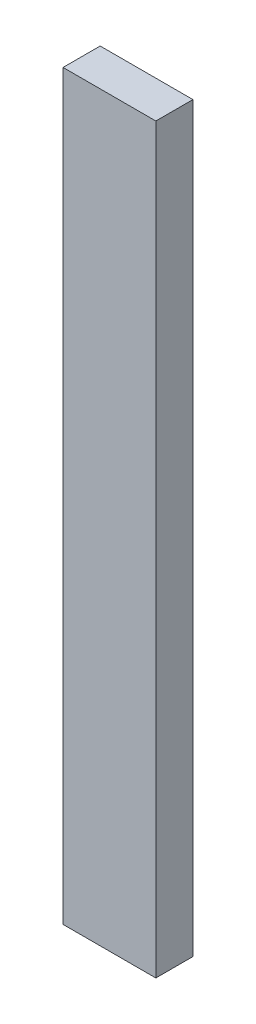
ISO-10303-21;
HEADER;
FILE_DESCRIPTION(('STEP AP214'),'2;1');
FILE_NAME('part.step','',(''),(''),'','','');
FILE_SCHEMA(('AUTOMOTIVE_DESIGN { 1 0 10303 214 1 1 1 1 }'));
ENDSEC;
DATA;
#1=APPLICATION_CONTEXT('core data for automotive mechanical design processes');
#2=APPLICATION_PROTOCOL_DEFINITION('international standard','automotive_design',2000,#1);
#3=PRODUCT_CONTEXT('',#1,'mechanical');
#4=PRODUCT('Part','Part','',(#3));
#5=PRODUCT_RELATED_PRODUCT_CATEGORY('part','',(#4));
#6=PRODUCT_DEFINITION_FORMATION('','',#4);
#7=PRODUCT_DEFINITION_CONTEXT('part definition',#1,'design');
#8=PRODUCT_DEFINITION('design','',#6,#7);
#9=PRODUCT_DEFINITION_SHAPE('','',#8);
#10=(LENGTH_UNIT() NAMED_UNIT(*) SI_UNIT(.MILLI.,.METRE.));
#11=(NAMED_UNIT(*) PLANE_ANGLE_UNIT() SI_UNIT($,.RADIAN.));
#12=(NAMED_UNIT(*) SI_UNIT($,.STERADIAN.) SOLID_ANGLE_UNIT());
#13=UNCERTAINTY_MEASURE_WITH_UNIT(LENGTH_MEASURE(1.E-05),#10,'distance_accuracy_value','');
#14=(GEOMETRIC_REPRESENTATION_CONTEXT(3) GLOBAL_UNCERTAINTY_ASSIGNED_CONTEXT((#13)) GLOBAL_UNIT_ASSIGNED_CONTEXT((#10,
#11,#12)) REPRESENTATION_CONTEXT('',''));
#15=CARTESIAN_POINT('',(0.,0.,0.));
#16=DIRECTION('',(0.,0.,1.));
#17=DIRECTION('',(1.,0.,0.));
#18=AXIS2_PLACEMENT_3D('',#15,#16,#17);
#19=CARTESIAN_POINT('',(0.,200.,0.));
#20=DIRECTION('',(1.,0.,0.));
#21=DIRECTION('',(0.,0.,-1.));
#22=AXIS2_PLACEMENT_3D('',#19,#20,#21);
#23=PLANE('',#22);
#24=DIRECTION('',(0.,0.,1.));
#25=VECTOR('',#24,1.);
#26=CARTESIAN_POINT('',(0.,0.,0.));
#27=LINE('',#26,#25);
#28=CARTESIAN_POINT('',(0.,0.,-10.));
#29=VERTEX_POINT('',#28);
#30=CARTESIAN_POINT('',(0.,0.,0.));
#31=VERTEX_POINT('',#30);
#32=EDGE_CURVE('E102',#29,#31,#27,.T.);
#33=ORIENTED_EDGE('',*,*,#32,.T.);
#34=DIRECTION('',(0.,-1.,0.));
#35=VECTOR('',#34,1.);
#36=CARTESIAN_POINT('',(0.,200.,0.));
#37=LINE('',#36,#35);
#38=CARTESIAN_POINT('',(0.,200.,0.));
#39=VERTEX_POINT('',#38);
#40=EDGE_CURVE('E11',#39,#31,#37,.T.);
#41=ORIENTED_EDGE('',*,*,#40,.F.);
#42=DIRECTION('',(0.,0.,1.));
#43=VECTOR('',#42,1.);
#44=CARTESIAN_POINT('',(0.,200.,0.));
#45=LINE('',#44,#43);
#46=CARTESIAN_POINT('',(0.,200.,-10.));
#47=VERTEX_POINT('',#46);
#48=EDGE_CURVE('E90',#47,#39,#45,.T.);
#49=ORIENTED_EDGE('',*,*,#48,.F.);
#50=DIRECTION('',(0.,-1.,0.));
#51=VECTOR('',#50,1.);
#52=CARTESIAN_POINT('',(0.,200.,-10.));
#53=LINE('',#52,#51);
#54=EDGE_CURVE('E98',#47,#29,#53,.T.);
#55=ORIENTED_EDGE('',*,*,#54,.T.);
#56=EDGE_LOOP('',(#33,#41,#49,#55));
#57=FACE_BOUND('',#56,.T.);
#58=ADVANCED_FACE('F39',(#57),#23,.F.);
#59=CARTESIAN_POINT('',(0.,200.,0.));
#60=DIRECTION('',(0.,0.,-1.));
#61=DIRECTION('',(-1.,0.,0.));
#62=AXIS2_PLACEMENT_3D('',#59,#60,#61);
#63=PLANE('',#62);
#64=DIRECTION('',(1.,0.,0.));
#65=VECTOR('',#64,1.);
#66=CARTESIAN_POINT('',(0.,0.,0.));
#67=LINE('',#66,#65);
#68=CARTESIAN_POINT('',(25.,0.,0.));
#69=VERTEX_POINT('',#68);
#70=EDGE_CURVE('E94',#31,#69,#67,.T.);
#71=ORIENTED_EDGE('',*,*,#70,.T.);
#72=DIRECTION('',(0.,-1.,0.));
#73=VECTOR('',#72,1.);
#74=CARTESIAN_POINT('',(25.,200.,0.));
#75=LINE('',#74,#73);
#76=CARTESIAN_POINT('',(25.,200.,0.));
#77=VERTEX_POINT('',#76);
#78=EDGE_CURVE('E47',#77,#69,#75,.T.);
#79=ORIENTED_EDGE('',*,*,#78,.F.);
#80=DIRECTION('',(1.,0.,0.));
#81=VECTOR('',#80,1.);
#82=CARTESIAN_POINT('',(0.,200.,0.));
#83=LINE('',#82,#81);
#84=EDGE_CURVE('E85',#39,#77,#83,.T.);
#85=ORIENTED_EDGE('',*,*,#84,.F.);
#86=ORIENTED_EDGE('',*,*,#40,.T.);
#87=EDGE_LOOP('',(#71,#79,#85,#86));
#88=FACE_BOUND('',#87,.T.);
#89=ADVANCED_FACE('F93',(#88),#63,.F.);
#90=CARTESIAN_POINT('',(25.,200.,0.));
#91=DIRECTION('',(-1.,0.,0.));
#92=DIRECTION('',(0.,0.,1.));
#93=AXIS2_PLACEMENT_3D('',#90,#91,#92);
#94=PLANE('',#93);
#95=DIRECTION('',(0.,0.,-1.));
#96=VECTOR('',#95,1.);
#97=CARTESIAN_POINT('',(25.,0.,0.));
#98=LINE('',#97,#96);
#99=CARTESIAN_POINT('',(25.,0.,-10.));
#100=VERTEX_POINT('',#99);
#101=EDGE_CURVE('E72',#69,#100,#98,.T.);
#102=ORIENTED_EDGE('',*,*,#101,.T.);
#103=DIRECTION('',(0.,-1.,0.));
#104=VECTOR('',#103,1.);
#105=CARTESIAN_POINT('',(25.,200.,-10.));
#106=LINE('',#105,#104);
#107=CARTESIAN_POINT('',(25.,200.,-10.));
#108=VERTEX_POINT('',#107);
#109=EDGE_CURVE('E95',#108,#100,#106,.T.);
#110=ORIENTED_EDGE('',*,*,#109,.F.);
#111=DIRECTION('',(0.,0.,-1.));
#112=VECTOR('',#111,1.);
#113=CARTESIAN_POINT('',(25.,200.,0.));
#114=LINE('',#113,#112);
#115=EDGE_CURVE('E88',#77,#108,#114,.T.);
#116=ORIENTED_EDGE('',*,*,#115,.F.);
#117=ORIENTED_EDGE('',*,*,#78,.T.);
#118=EDGE_LOOP('',(#102,#110,#116,#117));
#119=FACE_BOUND('',#118,.T.);
#120=ADVANCED_FACE('F96',(#119),#94,.F.);
#121=CARTESIAN_POINT('',(0.,200.,-10.));
#122=DIRECTION('',(0.,0.,1.));
#123=DIRECTION('',(1.,0.,0.));
#124=AXIS2_PLACEMENT_3D('',#121,#122,#123);
#125=PLANE('',#124);
#126=DIRECTION('',(-1.,0.,0.));
#127=VECTOR('',#126,1.);
#128=CARTESIAN_POINT('',(0.,0.,-10.));
#129=LINE('',#128,#127);
#130=EDGE_CURVE('E78',#100,#29,#129,.T.);
#131=ORIENTED_EDGE('',*,*,#130,.T.);
#132=ORIENTED_EDGE('',*,*,#54,.F.);
#133=DIRECTION('',(-1.,0.,0.));
#134=VECTOR('',#133,1.);
#135=CARTESIAN_POINT('',(0.,200.,-10.));
#136=LINE('',#135,#134);
#137=EDGE_CURVE('E55',#108,#47,#136,.T.);
#138=ORIENTED_EDGE('',*,*,#137,.F.);
#139=ORIENTED_EDGE('',*,*,#109,.T.);
#140=EDGE_LOOP('',(#131,#132,#138,#139));
#141=FACE_BOUND('',#140,.T.);
#142=ADVANCED_FACE('F109',(#141),#125,.F.);
#143=CARTESIAN_POINT('',(0.,200.,0.));
#144=DIRECTION('',(0.,-1.,0.));
#145=DIRECTION('',(0.,0.,-1.));
#146=AXIS2_PLACEMENT_3D('',#143,#144,#145);
#147=PLANE('',#146);
#148=ORIENTED_EDGE('',*,*,#48,.T.);
#149=ORIENTED_EDGE('',*,*,#84,.T.);
#150=ORIENTED_EDGE('',*,*,#115,.T.);
#151=ORIENTED_EDGE('',*,*,#137,.T.);
#152=EDGE_LOOP('',(#148,#149,#150,#151));
#153=FACE_BOUND('',#152,.T.);
#154=ADVANCED_FACE('F86',(#153),#147,.F.);
#155=CARTESIAN_POINT('',(0.,0.,0.));
#156=DIRECTION('',(0.,-1.,0.));
#157=DIRECTION('',(0.,0.,-1.));
#158=AXIS2_PLACEMENT_3D('',#155,#156,#157);
#159=PLANE('',#158);
#160=ORIENTED_EDGE('',*,*,#32,.F.);
#161=ORIENTED_EDGE('',*,*,#130,.F.);
#162=ORIENTED_EDGE('',*,*,#101,.F.);
#163=ORIENTED_EDGE('',*,*,#70,.F.);
#164=EDGE_LOOP('',(#160,#161,#162,#163));
#165=FACE_BOUND('',#164,.T.);
#166=ADVANCED_FACE('F112',(#165),#159,.T.);
#167=CLOSED_SHELL('',(#58,#89,#120,#142,#154,#166));
#168=MANIFOLD_SOLID_BREP('B2',#167);
#169=ADVANCED_BREP_SHAPE_REPRESENTATION('',(#18,#168),#14);
#170=SHAPE_DEFINITION_REPRESENTATION(#9,#169);
ENDSEC;
END-ISO-10303-21;
